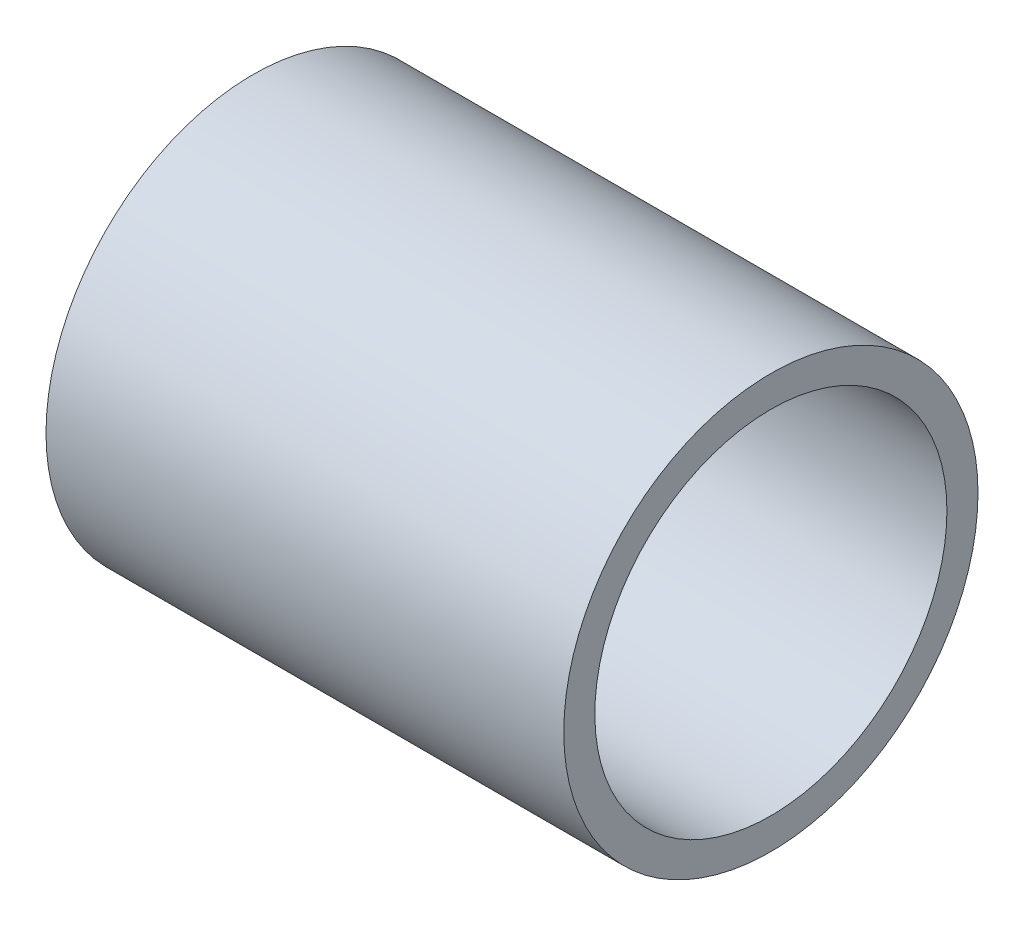
ISO-10303-21;
HEADER;
FILE_DESCRIPTION(('STEP AP214'),'2;1');
FILE_NAME('part.step','',(''),(''),'','','');
FILE_SCHEMA(('AUTOMOTIVE_DESIGN { 1 0 10303 214 1 1 1 1 }'));
ENDSEC;
DATA;
#1=APPLICATION_CONTEXT('core data for automotive mechanical design processes');
#2=APPLICATION_PROTOCOL_DEFINITION('international standard','automotive_design',2000,#1);
#3=PRODUCT_CONTEXT('',#1,'mechanical');
#4=PRODUCT('Part','Part','',(#3));
#5=PRODUCT_RELATED_PRODUCT_CATEGORY('part','',(#4));
#6=PRODUCT_DEFINITION_FORMATION('','',#4);
#7=PRODUCT_DEFINITION_CONTEXT('part definition',#1,'design');
#8=PRODUCT_DEFINITION('design','',#6,#7);
#9=PRODUCT_DEFINITION_SHAPE('','',#8);
#10=(LENGTH_UNIT() NAMED_UNIT(*) SI_UNIT(.MILLI.,.METRE.));
#11=(NAMED_UNIT(*) PLANE_ANGLE_UNIT() SI_UNIT($,.RADIAN.));
#12=(NAMED_UNIT(*) SI_UNIT($,.STERADIAN.) SOLID_ANGLE_UNIT());
#13=UNCERTAINTY_MEASURE_WITH_UNIT(LENGTH_MEASURE(1.E-05),#10,'distance_accuracy_value','');
#14=(GEOMETRIC_REPRESENTATION_CONTEXT(3) GLOBAL_UNCERTAINTY_ASSIGNED_CONTEXT((#13)) GLOBAL_UNIT_ASSIGNED_CONTEXT((#10,
#11,#12)) REPRESENTATION_CONTEXT('',''));
#15=CARTESIAN_POINT('',(0.,0.,0.));
#16=DIRECTION('',(0.,0.,1.));
#17=DIRECTION('',(1.,0.,0.));
#18=AXIS2_PLACEMENT_3D('',#15,#16,#17);
#19=CARTESIAN_POINT('',(20.,0.,0.));
#20=DIRECTION('',(-1.,0.,0.));
#21=DIRECTION('',(0.,0.,1.));
#22=AXIS2_PLACEMENT_3D('',#19,#20,#21);
#23=CYLINDRICAL_SURFACE('',#22,8.5);
#24=CARTESIAN_POINT('',(20.,0.,0.));
#25=DIRECTION('',(1.,0.,0.));
#26=DIRECTION('',(0.,0.,-1.));
#27=AXIS2_PLACEMENT_3D('',#24,#25,#26);
#28=CIRCLE('',#27,8.5);
#29=CARTESIAN_POINT('',(20.,0.,-8.5));
#30=VERTEX_POINT('',#29);
#31=EDGE_CURVE('E48',#30,#30,#28,.T.);
#32=ORIENTED_EDGE('',*,*,#31,.T.);
#33=EDGE_LOOP('',(#32));
#34=FACE_BOUND('',#33,.T.);
#35=CARTESIAN_POINT('',(0.,0.,0.));
#36=DIRECTION('',(-1.,0.,0.));
#37=DIRECTION('',(0.,0.,1.));
#38=AXIS2_PLACEMENT_3D('',#35,#36,#37);
#39=CIRCLE('',#38,8.5);
#40=CARTESIAN_POINT('',(0.,7.7,-3.6));
#41=VERTEX_POINT('',#40);
#42=CARTESIAN_POINT('',(0.,-7.7,-3.6));
#43=VERTEX_POINT('',#42);
#44=EDGE_CURVE('E55',#41,#43,#39,.F.);
#45=ORIENTED_EDGE('',*,*,#44,.F.);
#46=DIRECTION('',(1.,0.,0.));
#47=VECTOR('',#46,1.);
#48=CARTESIAN_POINT('',(-5.,7.7,-3.6));
#49=LINE('',#48,#47);
#50=CARTESIAN_POINT('',(-5.,7.7,-3.6));
#51=VERTEX_POINT('',#50);
#52=EDGE_CURVE('E75',#51,#41,#49,.T.);
#53=ORIENTED_EDGE('',*,*,#52,.F.);
#54=CARTESIAN_POINT('',(-5.,0.,0.));
#55=DIRECTION('',(-1.,0.,0.));
#56=DIRECTION('',(0.,0.,1.));
#57=AXIS2_PLACEMENT_3D('',#54,#55,#56);
#58=CIRCLE('',#57,8.5);
#59=CARTESIAN_POINT('',(-5.,-7.7,-3.6));
#60=VERTEX_POINT('',#59);
#61=EDGE_CURVE('E68',#51,#60,#58,.T.);
#62=ORIENTED_EDGE('',*,*,#61,.T.);
#63=DIRECTION('',(1.,0.,0.));
#64=VECTOR('',#63,1.);
#65=CARTESIAN_POINT('',(-5.,-7.7,-3.6));
#66=LINE('',#65,#64);
#67=EDGE_CURVE('E60',#60,#43,#66,.T.);
#68=ORIENTED_EDGE('',*,*,#67,.T.);
#69=EDGE_LOOP('',(#45,#53,#62,#68));
#70=FACE_BOUND('',#69,.T.);
#71=ADVANCED_FACE('F39',(#34,#70),#23,.F.);
#72=CARTESIAN_POINT('',(20.,0.,0.));
#73=DIRECTION('',(1.,0.,0.));
#74=DIRECTION('',(0.,0.,-1.));
#75=AXIS2_PLACEMENT_3D('',#72,#73,#74);
#76=PLANE('',#75);
#77=CARTESIAN_POINT('',(20.,0.,0.));
#78=DIRECTION('',(1.,0.,0.));
#79=DIRECTION('',(0.,0.,-1.));
#80=AXIS2_PLACEMENT_3D('',#77,#78,#79);
#81=CIRCLE('',#80,10.);
#82=CARTESIAN_POINT('',(20.,0.,-10.));
#83=VERTEX_POINT('',#82);
#84=EDGE_CURVE('E11',#83,#83,#81,.T.);
#85=ORIENTED_EDGE('',*,*,#84,.T.);
#86=EDGE_LOOP('',(#85));
#87=FACE_BOUND('',#86,.T.);
#88=ORIENTED_EDGE('',*,*,#31,.F.);
#89=EDGE_LOOP('',(#88));
#90=FACE_BOUND('',#89,.T.);
#91=ADVANCED_FACE('F98',(#87,#90),#76,.T.);
#92=CARTESIAN_POINT('',(20.,0.,0.));
#93=DIRECTION('',(-1.,0.,0.));
#94=DIRECTION('',(0.,0.,1.));
#95=AXIS2_PLACEMENT_3D('',#92,#93,#94);
#96=CYLINDRICAL_SURFACE('',#95,10.);
#97=ORIENTED_EDGE('',*,*,#84,.F.);
#98=EDGE_LOOP('',(#97));
#99=FACE_BOUND('',#98,.T.);
#100=CARTESIAN_POINT('',(-5.,0.,0.));
#101=DIRECTION('',(-1.,0.,0.));
#102=DIRECTION('',(0.,0.,1.));
#103=AXIS2_PLACEMENT_3D('',#100,#101,#102);
#104=CIRCLE('',#103,10.);
#105=CARTESIAN_POINT('',(-5.,0.,10.));
#106=VERTEX_POINT('',#105);
#107=EDGE_CURVE('E73',#106,#106,#104,.T.);
#108=ORIENTED_EDGE('',*,*,#107,.F.);
#109=EDGE_LOOP('',(#108));
#110=FACE_BOUND('',#109,.T.);
#111=ADVANCED_FACE('F41',(#99,#110),#96,.T.);
#112=CARTESIAN_POINT('',(-5.,0.,0.));
#113=DIRECTION('',(-1.,0.,0.));
#114=DIRECTION('',(0.,0.,1.));
#115=AXIS2_PLACEMENT_3D('',#112,#113,#114);
#116=PLANE('',#115);
#117=ORIENTED_EDGE('',*,*,#107,.T.);
#118=EDGE_LOOP('',(#117));
#119=FACE_BOUND('',#118,.T.);
#120=ORIENTED_EDGE('',*,*,#61,.F.);
#121=DIRECTION('',(0.,-1.,0.));
#122=VECTOR('',#121,1.);
#123=CARTESIAN_POINT('',(-5.,0.,-3.6));
#124=LINE('',#123,#122);
#125=EDGE_CURVE('E71',#51,#60,#124,.T.);
#126=ORIENTED_EDGE('',*,*,#125,.T.);
#127=EDGE_LOOP('',(#120,#126));
#128=FACE_BOUND('',#127,.T.);
#129=ADVANCED_FACE('F69',(#119,#128),#116,.T.);
#130=CARTESIAN_POINT('',(-5.,0.,-3.6));
#131=DIRECTION('',(0.,0.,1.));
#132=DIRECTION('',(0.,-1.,0.));
#133=AXIS2_PLACEMENT_3D('',#130,#131,#132);
#134=PLANE('',#133);
#135=DIRECTION('',(0.,-1.,0.));
#136=VECTOR('',#135,1.);
#137=CARTESIAN_POINT('',(0.,0.,-3.6));
#138=LINE('',#137,#136);
#139=EDGE_CURVE('E84',#41,#43,#138,.T.);
#140=ORIENTED_EDGE('',*,*,#139,.T.);
#141=ORIENTED_EDGE('',*,*,#67,.F.);
#142=ORIENTED_EDGE('',*,*,#125,.F.);
#143=ORIENTED_EDGE('',*,*,#52,.T.);
#144=EDGE_LOOP('',(#140,#141,#142,#143));
#145=FACE_BOUND('',#144,.T.);
#146=ADVANCED_FACE('F80',(#145),#134,.F.);
#147=CARTESIAN_POINT('',(0.,0.,0.));
#148=DIRECTION('',(-1.,0.,0.));
#149=DIRECTION('',(0.,0.,1.));
#150=AXIS2_PLACEMENT_3D('',#147,#148,#149);
#151=PLANE('',#150);
#152=ORIENTED_EDGE('',*,*,#139,.F.);
#153=ORIENTED_EDGE('',*,*,#44,.T.);
#154=EDGE_LOOP('',(#152,#153));
#155=FACE_BOUND('',#154,.T.);
#156=ADVANCED_FACE('F114',(#155),#151,.F.);
#157=CLOSED_SHELL('',(#71,#91,#111,#129,#146,#156));
#158=MANIFOLD_SOLID_BREP('B2',#157);
#159=ADVANCED_BREP_SHAPE_REPRESENTATION('',(#18,#158),#14);
#160=SHAPE_DEFINITION_REPRESENTATION(#9,#159);
ENDSEC;
END-ISO-10303-21;
